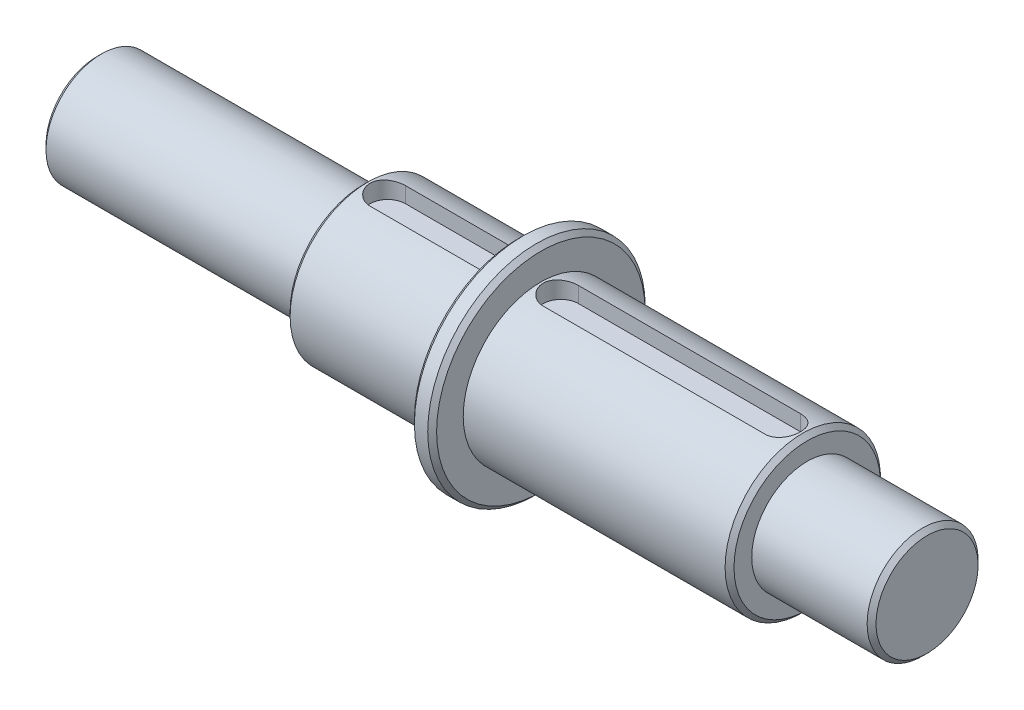
ISO-10303-21;
HEADER;
FILE_DESCRIPTION(('STEP AP214'),'2;1');
FILE_NAME('part.step','',(''),(''),'','','');
FILE_SCHEMA(('AUTOMOTIVE_DESIGN { 1 0 10303 214 1 1 1 1 }'));
ENDSEC;
DATA;
#1=APPLICATION_CONTEXT('core data for automotive mechanical design processes');
#2=APPLICATION_PROTOCOL_DEFINITION('international standard','automotive_design',2000,#1);
#3=PRODUCT_CONTEXT('',#1,'mechanical');
#4=PRODUCT('Part','Part','',(#3));
#5=PRODUCT_RELATED_PRODUCT_CATEGORY('part','',(#4));
#6=PRODUCT_DEFINITION_FORMATION('','',#4);
#7=PRODUCT_DEFINITION_CONTEXT('part definition',#1,'design');
#8=PRODUCT_DEFINITION('design','',#6,#7);
#9=PRODUCT_DEFINITION_SHAPE('','',#8);
#10=(LENGTH_UNIT() NAMED_UNIT(*) SI_UNIT(.MILLI.,.METRE.));
#11=(NAMED_UNIT(*) PLANE_ANGLE_UNIT() SI_UNIT($,.RADIAN.));
#12=(NAMED_UNIT(*) SI_UNIT($,.STERADIAN.) SOLID_ANGLE_UNIT());
#13=UNCERTAINTY_MEASURE_WITH_UNIT(LENGTH_MEASURE(1.E-05),#10,'distance_accuracy_value','');
#14=(GEOMETRIC_REPRESENTATION_CONTEXT(3) GLOBAL_UNCERTAINTY_ASSIGNED_CONTEXT((#13)) GLOBAL_UNIT_ASSIGNED_CONTEXT((#10,
#11,#12)) REPRESENTATION_CONTEXT('',''));
#15=CARTESIAN_POINT('',(0.,0.,0.));
#16=DIRECTION('',(0.,0.,1.));
#17=DIRECTION('',(1.,0.,0.));
#18=AXIS2_PLACEMENT_3D('',#15,#16,#17);
#19=CARTESIAN_POINT('',(-94.1955366631243,0.,0.));
#20=DIRECTION('',(1.,0.,0.));
#21=DIRECTION('',(0.,0.,-1.));
#22=AXIS2_PLACEMENT_3D('',#19,#20,#21);
#23=PLANE('',#22);
#24=CARTESIAN_POINT('',(-94.1955366631243,0.,0.));
#25=DIRECTION('',(-1.,0.,0.));
#26=DIRECTION('',(0.,0.,1.));
#27=AXIS2_PLACEMENT_3D('',#24,#25,#26);
#28=CIRCLE('',#27,11.5);
#29=CARTESIAN_POINT('',(-94.1955366631243,0.,11.5));
#30=VERTEX_POINT('',#29);
#31=EDGE_CURVE('E196',#30,#30,#28,.T.);
#32=ORIENTED_EDGE('',*,*,#31,.T.);
#33=EDGE_LOOP('',(#32));
#34=FACE_BOUND('',#33,.T.);
#35=ADVANCED_FACE('F33',(#34),#23,.F.);
#36=CARTESIAN_POINT('',(-93.1955366631243,0.,0.));
#37=DIRECTION('',(1.,0.,0.));
#38=DIRECTION('',(0.,0.,-1.));
#39=AXIS2_PLACEMENT_3D('',#36,#37,#38);
#40=CONICAL_SURFACE('',#39,12.5,0.785398163397448);
#41=ORIENTED_EDGE('',*,*,#31,.F.);
#42=EDGE_LOOP('',(#41));
#43=FACE_BOUND('',#42,.T.);
#44=CARTESIAN_POINT('',(-93.1955366631243,0.,0.));
#45=DIRECTION('',(-1.,0.,0.));
#46=DIRECTION('',(0.,0.,1.));
#47=AXIS2_PLACEMENT_3D('',#44,#45,#46);
#48=CIRCLE('',#47,12.5);
#49=CARTESIAN_POINT('',(-93.1955366631243,0.,12.5));
#50=VERTEX_POINT('',#49);
#51=EDGE_CURVE('E193',#50,#50,#48,.T.);
#52=ORIENTED_EDGE('',*,*,#51,.T.);
#53=EDGE_LOOP('',(#52));
#54=FACE_BOUND('',#53,.T.);
#55=ADVANCED_FACE('F285',(#43,#54),#40,.T.);
#56=CARTESIAN_POINT('',(-126.190223166844,0.,0.));
#57=DIRECTION('',(-1.,0.,0.));
#58=DIRECTION('',(0.,0.,1.));
#59=AXIS2_PLACEMENT_3D('',#56,#57,#58);
#60=CYLINDRICAL_SURFACE('',#59,12.5);
#61=ORIENTED_EDGE('',*,*,#51,.F.);
#62=EDGE_LOOP('',(#61));
#63=FACE_BOUND('',#62,.T.);
#64=CARTESIAN_POINT('',(-34.1955366631243,0.,0.));
#65=DIRECTION('',(-1.,0.,0.));
#66=DIRECTION('',(0.,0.,1.));
#67=AXIS2_PLACEMENT_3D('',#64,#65,#66);
#68=CIRCLE('',#67,12.5);
#69=CARTESIAN_POINT('',(-34.1955366631243,0.,12.5));
#70=VERTEX_POINT('',#69);
#71=EDGE_CURVE('E190',#70,#70,#68,.T.);
#72=ORIENTED_EDGE('',*,*,#71,.T.);
#73=EDGE_LOOP('',(#72));
#74=FACE_BOUND('',#73,.T.);
#75=ADVANCED_FACE('F290',(#63,#74),#60,.T.);
#76=CARTESIAN_POINT('',(-34.1955366631243,12.5,0.));
#77=DIRECTION('',(1.,0.,0.));
#78=DIRECTION('',(0.,0.,-1.));
#79=AXIS2_PLACEMENT_3D('',#76,#77,#78);
#80=PLANE('',#79);
#81=ORIENTED_EDGE('',*,*,#71,.F.);
#82=EDGE_LOOP('',(#81));
#83=FACE_BOUND('',#82,.T.);
#84=CARTESIAN_POINT('',(-34.1955366631243,0.,0.));
#85=DIRECTION('',(-1.,0.,0.));
#86=DIRECTION('',(0.,0.,1.));
#87=AXIS2_PLACEMENT_3D('',#84,#85,#86);
#88=CIRCLE('',#87,16.5);
#89=CARTESIAN_POINT('',(-34.1955366631243,0.,16.5));
#90=VERTEX_POINT('',#89);
#91=EDGE_CURVE('E187',#90,#90,#88,.T.);
#92=ORIENTED_EDGE('',*,*,#91,.T.);
#93=EDGE_LOOP('',(#92));
#94=FACE_BOUND('',#93,.T.);
#95=ADVANCED_FACE('F298',(#83,#94),#80,.F.);
#96=CARTESIAN_POINT('',(-33.1955366631243,0.,0.));
#97=DIRECTION('',(1.,0.,0.));
#98=DIRECTION('',(0.,0.,-1.));
#99=AXIS2_PLACEMENT_3D('',#96,#97,#98);
#100=CONICAL_SURFACE('',#99,17.5,0.785398163397448);
#101=ORIENTED_EDGE('',*,*,#91,.F.);
#102=EDGE_LOOP('',(#101));
#103=FACE_BOUND('',#102,.T.);
#104=CARTESIAN_POINT('',(-33.1955366631243,0.,0.));
#105=DIRECTION('',(-1.,0.,0.));
#106=DIRECTION('',(0.,0.,1.));
#107=AXIS2_PLACEMENT_3D('',#104,#105,#106);
#108=CIRCLE('',#107,17.5);
#109=CARTESIAN_POINT('',(-33.1955366631243,0.,17.5));
#110=VERTEX_POINT('',#109);
#111=EDGE_CURVE('E184',#110,#110,#108,.T.);
#112=ORIENTED_EDGE('',*,*,#111,.T.);
#113=EDGE_LOOP('',(#112));
#114=FACE_BOUND('',#113,.T.);
#115=ADVANCED_FACE('F304',(#103,#114),#100,.T.);
#116=CARTESIAN_POINT('',(-126.190223166844,0.,0.));
#117=DIRECTION('',(-1.,0.,0.));
#118=DIRECTION('',(0.,0.,1.));
#119=AXIS2_PLACEMENT_3D('',#116,#117,#118);
#120=CYLINDRICAL_SURFACE('',#119,17.5);
#121=DIRECTION('',(-1.,0.,0.));
#122=VECTOR('',#121,1.);
#123=CARTESIAN_POINT('',(-126.190223166844,17.0367250374008,-4.));
#124=LINE('',#123,#122);
#125=CARTESIAN_POINT('',(-28.6955366631243,17.0367250374008,-4.));
#126=VERTEX_POINT('',#125);
#127=CARTESIAN_POINT('',(-3.69553666312433,17.0367250374008,-4.));
#128=VERTEX_POINT('',#127);
#129=EDGE_CURVE('E450',#126,#128,#124,.F.);
#130=ORIENTED_EDGE('',*,*,#129,.T.);
#131=CARTESIAN_POINT('',(-3.69553666312433,17.0367250374008,-4.));
#132=CARTESIAN_POINT('',(-3.58460481410456,17.0367138660067,-4.00001248231752));
#133=CARTESIAN_POINT('',(-3.47368014016502,17.0378082617858,-3.99538546502867));
#134=CARTESIAN_POINT('',(-3.25265409588611,17.0421253952987,-3.97694932157873));
#135=CARTESIAN_POINT('',(-3.14255260631262,17.0453478185126,-3.96314155232038));
#136=CARTESIAN_POINT('',(-2.92414189825004,17.0538307536469,-3.92647318924765));
#137=CARTESIAN_POINT('',(-2.81582985492145,17.059087651771,-3.90362864568808));
#138=CARTESIAN_POINT('',(-2.60159577955464,17.0714746819689,-3.8490944107021));
#139=CARTESIAN_POINT('',(-2.49567376973885,17.0786048314525,-3.81740463706964));
#140=CARTESIAN_POINT('',(-2.18260166118932,17.1025105269156,-3.70940007909276));
#141=CARTESIAN_POINT('',(-1.97994737732587,17.1218095761762,-3.6201165136919));
#142=CARTESIAN_POINT('',(-1.59255547776641,17.1649441397841,-3.40971418070428));
#143=CARTESIAN_POINT('',(-1.40782133912761,17.1887805318677,-3.28858925176468));
#144=CARTESIAN_POINT('',(-1.05803054214704,17.2387926899631,-3.01555269417646));
#145=CARTESIAN_POINT('',(-0.893347197486583,17.2650004661165,-2.8631677865296));
#146=CARTESIAN_POINT('',(-0.59163714694968,17.3165247611238,-2.53295238865313));
#147=CARTESIAN_POINT('',(-0.454614791855364,17.3418411392541,-2.35511790297881));
#148=CARTESIAN_POINT('',(-0.210616343085567,17.3890809668325,-1.97651609742511));
#149=CARTESIAN_POINT('',(-0.104004740459063,17.410961949179,-1.77550809318057));
#150=CARTESIAN_POINT('',(0.0737762546514129,17.4484992744045,-1.35785483515843));
#151=CARTESIAN_POINT('',(0.144951827978446,17.4641567027157,-1.14121231594595));
#152=CARTESIAN_POINT('',(0.248658322795789,17.4872566687127,-0.702348968435727));
#153=CARTESIAN_POINT('',(0.28182724872572,17.4948346770719,-0.480286158684643));
#154=CARTESIAN_POINT('',(0.310575995234099,17.5013922359856,-0.0336222528298666));
#155=CARTESIAN_POINT('',(0.306159643764582,17.5003726621791,0.190978582456414));
#156=CARTESIAN_POINT('',(0.260332286863607,17.489952340558,0.631926010215037));
#157=CARTESIAN_POINT('',(0.219610131994176,17.4807076590668,0.848348430712727));
#158=CARTESIAN_POINT('',(0.103427371770545,17.4550549045918,1.27120201757733));
#159=CARTESIAN_POINT('',(0.027965390159794,17.4386465478123,1.4776327877559));
#160=CARTESIAN_POINT('',(-0.156146943612312,17.4002626903077,1.87652973429282));
#161=CARTESIAN_POINT('',(-0.265054023060563,17.3782443578209,2.06887311134545));
#162=CARTESIAN_POINT('',(-0.512779675138129,17.3310474587669,2.43280009121924));
#163=CARTESIAN_POINT('',(-0.65160185262817,17.3058685114888,2.60438118822771));
#164=CARTESIAN_POINT('',(-0.958894797972993,17.2544419046369,2.92598580900956));
#165=CARTESIAN_POINT('',(-1.12796440070044,17.2281829516239,3.07543489417491));
#166=CARTESIAN_POINT('',(-1.48920196613512,17.1780692090276,3.34405202485233));
#167=CARTESIAN_POINT('',(-1.68137622076386,17.1542150775981,3.46321179425783));
#168=CARTESIAN_POINT('',(-1.98315850428012,17.1222689727167,3.61671597326183));
#169=CARTESIAN_POINT('',(-2.08628698762569,17.1122387789592,3.66376574815988));
#170=CARTESIAN_POINT('',(-2.29627486329387,17.0937715302981,3.7489839926838));
#171=CARTESIAN_POINT('',(-2.4031327615524,17.0853338458964,3.78715597297674));
#172=CARTESIAN_POINT('',(-2.61970405454273,17.0703178704533,3.85427424858371));
#173=CARTESIAN_POINT('',(-2.72941436172098,17.0637376534167,3.88323010403838));
#174=CARTESIAN_POINT('',(-2.95095569027301,17.0526294698307,3.9317231468982));
#175=CARTESIAN_POINT('',(-3.06278568563791,17.0481005355421,3.95126477595514));
#176=CARTESIAN_POINT('',(-3.26153373797797,17.0420340571271,3.97733749089981));
#177=CARTESIAN_POINT('',(-3.34818510043883,17.0400453891908,3.98583914323426));
#178=CARTESIAN_POINT('',(-3.52173396015255,17.0373899876292,3.99716769798061));
#179=CARTESIAN_POINT('',(-3.60863081316125,17.0367210727584,4.00000396405785));
#180=CARTESIAN_POINT('',(-3.69553666312433,17.0367250374008,4.));
#181=B_SPLINE_CURVE_WITH_KNOTS('',3,(#131,#132,#133,#134,#135,#136,#137,#138,#139,#140,#141,
#142,#143,#144,#145,#146,#147,#148,#149,#150,#151,#152,#153,#154,#155,#156,#157,#158,#159,#160,
#161,#162,#163,#164,#165,#166,#167,#168,#169,#170,#171,#172,#173,#174,#175,#176,#177,#178,#179,
#180),.UNSPECIFIED.,.F.,.F.,(4,2,2,2,2,2,2,2,2,2,2,2,2,2,2,2,2,2,2,2,2,2,2,2,4),(0.,
0.332681247866697,0.665313336820848,0.997357270100383,1.32940428944207,1.99290262989595,
2.65652945292504,3.33106339250548,4.00570334664101,4.68811868485082,5.37041495269124,
6.0410817607265,6.71168026410031,7.36981967360707,8.02798515827641,8.69133469760162,
9.35476421731793,10.0331782060872,10.7117773626502,11.0528239514451,11.3937354453644,
11.7342921410368,12.0746880036043,12.3357711604052,12.5964224446493),.UNSPECIFIED.);
#182=CARTESIAN_POINT('',(-3.69553666312433,17.0367250374008,4.));
#183=VERTEX_POINT('',#182);
#184=EDGE_CURVE('E199',#128,#183,#181,.T.);
#185=ORIENTED_EDGE('',*,*,#184,.T.);
#186=DIRECTION('',(-1.,0.,0.));
#187=VECTOR('',#186,1.);
#188=CARTESIAN_POINT('',(-126.190223166844,17.0367250374008,4.));
#189=LINE('',#188,#187);
#190=CARTESIAN_POINT('',(-28.6955366631243,17.0367250374008,4.));
#191=VERTEX_POINT('',#190);
#192=EDGE_CURVE('E452',#183,#191,#189,.T.);
#193=ORIENTED_EDGE('',*,*,#192,.T.);
#194=CARTESIAN_POINT('',(-28.6955366631243,17.0367250374008,4.));
#195=CARTESIAN_POINT('',(-28.8064685121441,17.0367138660067,4.00001248231751));
#196=CARTESIAN_POINT('',(-28.9173931860836,17.0378082617858,3.99538546502867));
#197=CARTESIAN_POINT('',(-29.1384192303626,17.0421253952987,3.97694932157873));
#198=CARTESIAN_POINT('',(-29.248520719936,17.0453478185126,3.96314155232038));
#199=CARTESIAN_POINT('',(-29.4669314279986,17.0538307536469,3.92647318924765));
#200=CARTESIAN_POINT('',(-29.5752434713272,17.059087651771,3.90362864568808));
#201=CARTESIAN_POINT('',(-29.789477546694,17.0714746819689,3.8490944107021));
#202=CARTESIAN_POINT('',(-29.8953995565098,17.0786048314525,3.81740463706964));
#203=CARTESIAN_POINT('',(-30.2084716650593,17.1025105269156,3.70940007909276));
#204=CARTESIAN_POINT('',(-30.4111259489228,17.1218095761762,3.6201165136919));
#205=CARTESIAN_POINT('',(-30.7985178484823,17.1649441397841,3.40971418070428));
#206=CARTESIAN_POINT('',(-30.9832519871211,17.1887805318677,3.28858925176468));
#207=CARTESIAN_POINT('',(-31.3330427841016,17.2387926899631,3.01555269417646));
#208=CARTESIAN_POINT('',(-31.4977261287621,17.2650004661165,2.86316778652959));
#209=CARTESIAN_POINT('',(-31.799436179299,17.3165247611238,2.53295238865313));
#210=CARTESIAN_POINT('',(-31.9364585343933,17.3418411392541,2.35511790297881));
#211=CARTESIAN_POINT('',(-32.1804569831631,17.3890809668325,1.97651609742511));
#212=CARTESIAN_POINT('',(-32.2870685857896,17.410961949179,1.77550809318057));
#213=CARTESIAN_POINT('',(-32.4648495809001,17.4484992744045,1.35785483515843));
#214=CARTESIAN_POINT('',(-32.5360251542271,17.4641567027157,1.14121231594595));
#215=CARTESIAN_POINT('',(-32.6397316490444,17.4872566687127,0.702348968435725));
#216=CARTESIAN_POINT('',(-32.6729005749744,17.4948346770719,0.480286158684641));
#217=CARTESIAN_POINT('',(-32.7016493214828,17.5013922359856,0.0336222528298658));
#218=CARTESIAN_POINT('',(-32.6972329700132,17.5003726621791,-0.190978582456415));
#219=CARTESIAN_POINT('',(-32.6514056131123,17.489952340558,-0.631926010215037));
#220=CARTESIAN_POINT('',(-32.6106834582428,17.4807076590668,-0.848348430712726));
#221=CARTESIAN_POINT('',(-32.4945006980192,17.4550549045918,-1.27120201757732));
#222=CARTESIAN_POINT('',(-32.4190387164085,17.4386465478123,-1.4776327877559));
#223=CARTESIAN_POINT('',(-32.2349263826363,17.4002626903077,-1.87652973429282));
#224=CARTESIAN_POINT('',(-32.1260193031881,17.3782443578209,-2.06887311134545));
#225=CARTESIAN_POINT('',(-31.8782936511105,17.3310474587669,-2.43280009121924));
#226=CARTESIAN_POINT('',(-31.7394714736205,17.3058685114888,-2.60438118822771));
#227=CARTESIAN_POINT('',(-31.4321785282757,17.2544419046369,-2.92598580900956));
#228=CARTESIAN_POINT('',(-31.2631089255482,17.2281829516239,-3.0754348941749));
#229=CARTESIAN_POINT('',(-30.9018713601135,17.1780692090276,-3.34405202485233));
#230=CARTESIAN_POINT('',(-30.7096971054848,17.1542150775981,-3.46321179425783));
#231=CARTESIAN_POINT('',(-30.4079148219685,17.1222689727167,-3.61671597326183));
#232=CARTESIAN_POINT('',(-30.304786338623,17.1122387789592,-3.66376574815988));
#233=CARTESIAN_POINT('',(-30.0947984629548,17.0937715302981,-3.7489839926838));
#234=CARTESIAN_POINT('',(-29.9879405646963,17.0853338458964,-3.78715597297674));
#235=CARTESIAN_POINT('',(-29.7713692717059,17.0703178704533,-3.8542742485837));
#236=CARTESIAN_POINT('',(-29.6616589645277,17.0637376534167,-3.88323010403838));
#237=CARTESIAN_POINT('',(-29.4401176359756,17.0526294698307,-3.9317231468982));
#238=CARTESIAN_POINT('',(-29.3282876406107,17.0481005355421,-3.95126477595514));
#239=CARTESIAN_POINT('',(-29.1295395882707,17.0420340571271,-3.97733749089981));
#240=CARTESIAN_POINT('',(-29.0428882258098,17.0400453891908,-3.98583914323426));
#241=CARTESIAN_POINT('',(-28.8693393660961,17.0373899876292,-3.99716769798061));
#242=CARTESIAN_POINT('',(-28.7824425130874,17.0367210727584,-4.00000396405785));
#243=CARTESIAN_POINT('',(-28.6955366631243,17.0367250374008,-4.));
#244=B_SPLINE_CURVE_WITH_KNOTS('',3,(#194,#195,#196,#197,#198,#199,#200,#201,#202,#203,#204,
#205,#206,#207,#208,#209,#210,#211,#212,#213,#214,#215,#216,#217,#218,#219,#220,#221,#222,#223,
#224,#225,#226,#227,#228,#229,#230,#231,#232,#233,#234,#235,#236,#237,#238,#239,#240,#241,#242,
#243),.UNSPECIFIED.,.F.,.F.,(4,2,2,2,2,2,2,2,2,2,2,2,2,2,2,2,2,2,2,2,2,2,2,2,4),(0.,
0.332681247866694,0.665313336820848,0.997357270100378,1.32940428944207,1.99290262989595,
2.65652945292504,3.33106339250549,4.005703346641,4.68811868485082,5.37041495269124,
6.0410817607265,6.71168026410032,7.36981967360707,8.02798515827642,8.69133469760162,
9.35476421731793,10.0331782060872,10.7117773626502,11.0528239514451,11.3937354453644,
11.7342921410368,12.0746880036043,12.3357711604052,12.5964224446493),.UNSPECIFIED.);
#245=EDGE_CURVE('E55',#191,#126,#244,.T.);
#246=ORIENTED_EDGE('',*,*,#245,.T.);
#247=EDGE_LOOP('',(#130,#185,#193,#246));
#248=FACE_BOUND('',#247,.T.);
#249=ORIENTED_EDGE('',*,*,#111,.F.);
#250=EDGE_LOOP('',(#249));
#251=FACE_BOUND('',#250,.T.);
#252=CARTESIAN_POINT('',(0.804463336875672,0.,0.));
#253=DIRECTION('',(-1.,0.,0.));
#254=DIRECTION('',(0.,0.,1.));
#255=AXIS2_PLACEMENT_3D('',#252,#253,#254);
#256=CIRCLE('',#255,17.5);
#257=CARTESIAN_POINT('',(0.804463336875672,0.,17.5));
#258=VERTEX_POINT('',#257);
#259=EDGE_CURVE('E181',#258,#258,#256,.T.);
#260=ORIENTED_EDGE('',*,*,#259,.T.);
#261=EDGE_LOOP('',(#260));
#262=FACE_BOUND('',#261,.T.);
#263=ADVANCED_FACE('F214',(#248,#251,#262),#120,.T.);
#264=CARTESIAN_POINT('',(0.804463336875672,17.5,0.));
#265=DIRECTION('',(1.,0.,0.));
#266=DIRECTION('',(0.,0.,-1.));
#267=AXIS2_PLACEMENT_3D('',#264,#265,#266);
#268=PLANE('',#267);
#269=ORIENTED_EDGE('',*,*,#259,.F.);
#270=EDGE_LOOP('',(#269));
#271=FACE_BOUND('',#270,.T.);
#272=CARTESIAN_POINT('',(0.804463336875672,0.,0.));
#273=DIRECTION('',(-1.,0.,0.));
#274=DIRECTION('',(0.,0.,1.));
#275=AXIS2_PLACEMENT_3D('',#272,#273,#274);
#276=CIRCLE('',#275,23.5);
#277=CARTESIAN_POINT('',(0.804463336875672,0.,23.5));
#278=VERTEX_POINT('',#277);
#279=EDGE_CURVE('E178',#278,#278,#276,.T.);
#280=ORIENTED_EDGE('',*,*,#279,.T.);
#281=EDGE_LOOP('',(#280));
#282=FACE_BOUND('',#281,.T.);
#283=ADVANCED_FACE('F314',(#271,#282),#268,.F.);
#284=CARTESIAN_POINT('',(1.80446333687567,0.,0.));
#285=DIRECTION('',(1.,0.,0.));
#286=DIRECTION('',(0.,0.,-1.));
#287=AXIS2_PLACEMENT_3D('',#284,#285,#286);
#288=CONICAL_SURFACE('',#287,24.5,0.785398163397448);
#289=ORIENTED_EDGE('',*,*,#279,.F.);
#290=EDGE_LOOP('',(#289));
#291=FACE_BOUND('',#290,.T.);
#292=CARTESIAN_POINT('',(1.80446333687567,0.,0.));
#293=DIRECTION('',(-1.,0.,0.));
#294=DIRECTION('',(0.,0.,1.));
#295=AXIS2_PLACEMENT_3D('',#292,#293,#294);
#296=CIRCLE('',#295,24.5);
#297=CARTESIAN_POINT('',(1.80446333687567,0.,24.5));
#298=VERTEX_POINT('',#297);
#299=EDGE_CURVE('E175',#298,#298,#296,.T.);
#300=ORIENTED_EDGE('',*,*,#299,.T.);
#301=EDGE_LOOP('',(#300));
#302=FACE_BOUND('',#301,.T.);
#303=ADVANCED_FACE('F320',(#291,#302),#288,.T.);
#304=CARTESIAN_POINT('',(-126.190223166844,0.,0.));
#305=DIRECTION('',(-1.,0.,0.));
#306=DIRECTION('',(0.,0.,1.));
#307=AXIS2_PLACEMENT_3D('',#304,#305,#306);
#308=CYLINDRICAL_SURFACE('',#307,24.5);
#309=ORIENTED_EDGE('',*,*,#299,.F.);
#310=EDGE_LOOP('',(#309));
#311=FACE_BOUND('',#310,.T.);
#312=CARTESIAN_POINT('',(4.80446333687568,0.,0.));
#313=DIRECTION('',(-1.,0.,0.));
#314=DIRECTION('',(0.,0.,1.));
#315=AXIS2_PLACEMENT_3D('',#312,#313,#314);
#316=CIRCLE('',#315,24.5);
#317=CARTESIAN_POINT('',(4.80446333687568,0.,24.5));
#318=VERTEX_POINT('',#317);
#319=EDGE_CURVE('E172',#318,#318,#316,.T.);
#320=ORIENTED_EDGE('',*,*,#319,.T.);
#321=EDGE_LOOP('',(#320));
#322=FACE_BOUND('',#321,.T.);
#323=ADVANCED_FACE('F325',(#311,#322),#308,.T.);
#324=CARTESIAN_POINT('',(5.80446333687568,0.,0.));
#325=DIRECTION('',(-1.,0.,0.));
#326=DIRECTION('',(0.,0.,1.));
#327=AXIS2_PLACEMENT_3D('',#324,#325,#326);
#328=CONICAL_SURFACE('',#327,23.5,0.785398163397448);
#329=ORIENTED_EDGE('',*,*,#319,.F.);
#330=EDGE_LOOP('',(#329));
#331=FACE_BOUND('',#330,.T.);
#332=CARTESIAN_POINT('',(5.80446333687568,0.,0.));
#333=DIRECTION('',(-1.,0.,0.));
#334=DIRECTION('',(0.,0.,1.));
#335=AXIS2_PLACEMENT_3D('',#332,#333,#334);
#336=CIRCLE('',#335,23.5);
#337=CARTESIAN_POINT('',(5.80446333687568,0.,23.5));
#338=VERTEX_POINT('',#337);
#339=EDGE_CURVE('E169',#338,#338,#336,.T.);
#340=ORIENTED_EDGE('',*,*,#339,.T.);
#341=EDGE_LOOP('',(#340));
#342=FACE_BOUND('',#341,.T.);
#343=ADVANCED_FACE('F331',(#331,#342),#328,.T.);
#344=CARTESIAN_POINT('',(5.80446333687568,23.5,0.));
#345=DIRECTION('',(-1.,0.,0.));
#346=DIRECTION('',(0.,0.,1.));
#347=AXIS2_PLACEMENT_3D('',#344,#345,#346);
#348=PLANE('',#347);
#349=ORIENTED_EDGE('',*,*,#339,.F.);
#350=EDGE_LOOP('',(#349));
#351=FACE_BOUND('',#350,.T.);
#352=CARTESIAN_POINT('',(5.80446333687568,0.,0.));
#353=DIRECTION('',(-1.,0.,0.));
#354=DIRECTION('',(0.,0.,1.));
#355=AXIS2_PLACEMENT_3D('',#352,#353,#354);
#356=CIRCLE('',#355,17.5);
#357=CARTESIAN_POINT('',(5.80446333687568,0.,17.5));
#358=VERTEX_POINT('',#357);
#359=EDGE_CURVE('E166',#358,#358,#356,.T.);
#360=ORIENTED_EDGE('',*,*,#359,.T.);
#361=EDGE_LOOP('',(#360));
#362=FACE_BOUND('',#361,.T.);
#363=ADVANCED_FACE('F258',(#351,#362),#348,.F.);
#364=CARTESIAN_POINT('',(-126.190223166844,0.,0.));
#365=DIRECTION('',(-1.,0.,0.));
#366=DIRECTION('',(0.,0.,1.));
#367=AXIS2_PLACEMENT_3D('',#364,#365,#366);
#368=CYLINDRICAL_SURFACE('',#367,17.5);
#369=DIRECTION('',(-1.,0.,0.));
#370=VECTOR('',#369,1.);
#371=CARTESIAN_POINT('',(-126.190223166844,17.0367250374008,-4.));
#372=LINE('',#371,#370);
#373=CARTESIAN_POINT('',(10.3044633368757,17.0367250374008,-4.));
#374=VERTEX_POINT('',#373);
#375=CARTESIAN_POINT('',(60.3044633368757,17.0367250374008,-4.));
#376=VERTEX_POINT('',#375);
#377=EDGE_CURVE('E11',#374,#376,#372,.F.);
#378=ORIENTED_EDGE('',*,*,#377,.T.);
#379=CARTESIAN_POINT('',(60.3044633368757,17.0367250374008,-4.));
#380=CARTESIAN_POINT('',(60.4153951858954,17.0367138660067,-4.00001248231751));
#381=CARTESIAN_POINT('',(60.526319859835,17.0378082617858,-3.99538546502867));
#382=CARTESIAN_POINT('',(60.7473459041139,17.0421253952987,-3.97694932157872));
#383=CARTESIAN_POINT('',(60.8574473936874,17.0453478185126,-3.96314155232038));
#384=CARTESIAN_POINT('',(61.07585810175,17.0538307536469,-3.92647318924765));
#385=CARTESIAN_POINT('',(61.1841701450785,17.059087651771,-3.90362864568808));
#386=CARTESIAN_POINT('',(61.3984042204454,17.0714746819689,-3.8490944107021));
#387=CARTESIAN_POINT('',(61.5043262302611,17.0786048314525,-3.81740463706963));
#388=CARTESIAN_POINT('',(61.8173983388107,17.1025105269156,-3.70940007909276));
#389=CARTESIAN_POINT('',(62.0200526226741,17.1218095761762,-3.6201165136919));
#390=CARTESIAN_POINT('',(62.4074445222336,17.1649441397841,-3.40971418070429));
#391=CARTESIAN_POINT('',(62.5921786608724,17.1887805318677,-3.28858925176469));
#392=CARTESIAN_POINT('',(62.9419694578529,17.2387926899631,-3.01555269417647));
#393=CARTESIAN_POINT('',(63.1066528025134,17.2650004661165,-2.8631677865296));
#394=CARTESIAN_POINT('',(63.4083628530503,17.3165247611238,-2.53295238865314));
#395=CARTESIAN_POINT('',(63.5453852081446,17.3418411392541,-2.35511790297881));
#396=CARTESIAN_POINT('',(63.7893836569144,17.3890809668325,-1.97651609742511));
#397=CARTESIAN_POINT('',(63.8959952595409,17.410961949179,-1.77550809318057));
#398=CARTESIAN_POINT('',(64.0737762546514,17.4484992744045,-1.35785483515843));
#399=CARTESIAN_POINT('',(64.1449518279785,17.4641567027157,-1.14121231594596));
#400=CARTESIAN_POINT('',(64.2486583227958,17.4872566687127,-0.702348968435736));
#401=CARTESIAN_POINT('',(64.2818272487257,17.4948346770719,-0.48028615868465));
#402=CARTESIAN_POINT('',(64.3105759952341,17.5013922359856,-0.0336222528298706));
#403=CARTESIAN_POINT('',(64.3061596437646,17.5003726621791,0.190978582456411));
#404=CARTESIAN_POINT('',(64.2603322868636,17.489952340558,0.631926010215034));
#405=CARTESIAN_POINT('',(64.2196101319942,17.4807076590668,0.848348430712724));
#406=CARTESIAN_POINT('',(64.1034273717706,17.4550549045918,1.27120201757732));
#407=CARTESIAN_POINT('',(64.0279653901598,17.4386465478123,1.47763278775589));
#408=CARTESIAN_POINT('',(63.8438530563877,17.4002626903077,1.87652973429281));
#409=CARTESIAN_POINT('',(63.7349459769394,17.3782443578209,2.06887311134544));
#410=CARTESIAN_POINT('',(63.4872203248619,17.3310474587669,2.43280009121923));
#411=CARTESIAN_POINT('',(63.3483981473718,17.3058685114888,2.6043811882277));
#412=CARTESIAN_POINT('',(63.041105202027,17.2544419046369,2.92598580900956));
#413=CARTESIAN_POINT('',(62.8720355992996,17.2281829516239,3.0754348941749));
#414=CARTESIAN_POINT('',(62.5107980338649,17.1780692090276,3.34405202485233));
#415=CARTESIAN_POINT('',(62.3186237792361,17.1542150775981,3.46321179425783));
#416=CARTESIAN_POINT('',(62.0168414957199,17.1222689727167,3.61671597326183));
#417=CARTESIAN_POINT('',(61.9137130123743,17.1122387789592,3.66376574815988));
#418=CARTESIAN_POINT('',(61.7037251367061,17.0937715302981,3.7489839926838));
#419=CARTESIAN_POINT('',(61.5968672384476,17.0853338458964,3.78715597297673));
#420=CARTESIAN_POINT('',(61.3802959454573,17.0703178704533,3.8542742485837));
#421=CARTESIAN_POINT('',(61.270585638279,17.0637376534167,3.88323010403837));
#422=CARTESIAN_POINT('',(61.049044309727,17.0526294698307,3.93172314689819));
#423=CARTESIAN_POINT('',(60.9372143143621,17.0481005355421,3.95126477595513));
#424=CARTESIAN_POINT('',(60.7384662620221,17.0420340571271,3.97733749089981));
#425=CARTESIAN_POINT('',(60.6518148995612,17.0400453891908,3.98583914323426));
#426=CARTESIAN_POINT('',(60.4782660398475,17.0373899876292,3.99716769798061));
#427=CARTESIAN_POINT('',(60.3913691868388,17.0367210727584,4.00000396405785));
#428=CARTESIAN_POINT('',(60.3044633368757,17.0367250374008,4.));
#429=B_SPLINE_CURVE_WITH_KNOTS('',3,(#379,#380,#381,#382,#383,#384,#385,#386,#387,#388,#389,
#390,#391,#392,#393,#394,#395,#396,#397,#398,#399,#400,#401,#402,#403,#404,#405,#406,#407,#408,
#409,#410,#411,#412,#413,#414,#415,#416,#417,#418,#419,#420,#421,#422,#423,#424,#425,#426,#427,
#428),.UNSPECIFIED.,.F.,.F.,(4,2,2,2,2,2,2,2,2,2,2,2,2,2,2,2,2,2,2,2,2,2,2,2,4),(0.,
0.332681247866701,0.665313336820848,0.997357270100385,1.32940428944207,1.99290262989594,
2.65652945292503,3.33106339250548,4.005703346641,4.68811868485081,5.37041495269123,
6.04108176072649,6.71168026410031,7.36981967360707,8.02798515827641,8.69133469760161,
9.35476421731792,10.0331782060872,10.7117773626502,11.0528239514451,11.3937354453644,
11.7342921410368,12.0746880036043,12.3357711604052,12.5964224446493),.UNSPECIFIED.);
#430=CARTESIAN_POINT('',(60.3044633368757,17.0367250374008,4.));
#431=VERTEX_POINT('',#430);
#432=EDGE_CURVE('E263',#376,#431,#429,.T.);
#433=ORIENTED_EDGE('',*,*,#432,.T.);
#434=DIRECTION('',(-1.,0.,0.));
#435=VECTOR('',#434,1.);
#436=CARTESIAN_POINT('',(-126.190223166844,17.0367250374008,4.));
#437=LINE('',#436,#435);
#438=CARTESIAN_POINT('',(10.3044633368757,17.0367250374008,4.));
#439=VERTEX_POINT('',#438);
#440=EDGE_CURVE('E40',#431,#439,#437,.T.);
#441=ORIENTED_EDGE('',*,*,#440,.T.);
#442=CARTESIAN_POINT('',(10.3044633368757,17.0367250374008,4.));
#443=CARTESIAN_POINT('',(10.1935314878559,17.0367138660067,4.00001248231751));
#444=CARTESIAN_POINT('',(10.0826068139164,17.0378082617858,3.99538546502867));
#445=CARTESIAN_POINT('',(9.86158076963745,17.0421253952987,3.97694932157872));
#446=CARTESIAN_POINT('',(9.75147928006396,17.0453478185126,3.96314155232038));
#447=CARTESIAN_POINT('',(9.53306857200138,17.0538307536469,3.92647318924765));
#448=CARTESIAN_POINT('',(9.4247565286728,17.059087651771,3.90362864568808));
#449=CARTESIAN_POINT('',(9.21052245330598,17.0714746819689,3.8490944107021));
#450=CARTESIAN_POINT('',(9.1046004434902,17.0786048314525,3.81740463706963));
#451=CARTESIAN_POINT('',(8.79152833494067,17.1025105269156,3.70940007909276));
#452=CARTESIAN_POINT('',(8.58887405107721,17.1218095761762,3.6201165136919));
#453=CARTESIAN_POINT('',(8.20148215151775,17.1649441397841,3.40971418070428));
#454=CARTESIAN_POINT('',(8.01674801287895,17.1887805318677,3.28858925176468));
#455=CARTESIAN_POINT('',(7.66695721589839,17.2387926899631,3.01555269417646));
#456=CARTESIAN_POINT('',(7.50227387123793,17.2650004661165,2.86316778652959));
#457=CARTESIAN_POINT('',(7.20056382070102,17.3165247611238,2.53295238865313));
#458=CARTESIAN_POINT('',(7.06354146560671,17.3418411392541,2.35511790297881));
#459=CARTESIAN_POINT('',(6.81954301683691,17.3890809668325,1.97651609742511));
#460=CARTESIAN_POINT('',(6.71293141421041,17.410961949179,1.77550809318057));
#461=CARTESIAN_POINT('',(6.53515041909993,17.4484992744045,1.35785483515843));
#462=CARTESIAN_POINT('',(6.4639748457729,17.4641567027157,1.14121231594595));
#463=CARTESIAN_POINT('',(6.36026835095556,17.4872566687127,0.702348968435728));
#464=CARTESIAN_POINT('',(6.32709942502562,17.4948346770719,0.480286158684644));
#465=CARTESIAN_POINT('',(6.29835067851725,17.5013922359856,0.0336222528298681));
#466=CARTESIAN_POINT('',(6.30276702998676,17.5003726621791,-0.190978582456412));
#467=CARTESIAN_POINT('',(6.34859438688774,17.489952340558,-0.631926010215035));
#468=CARTESIAN_POINT('',(6.38931654175717,17.4807076590668,-0.848348430712725));
#469=CARTESIAN_POINT('',(6.5054993019808,17.4550549045918,-1.27120201757732));
#470=CARTESIAN_POINT('',(6.58096128359155,17.4386465478123,-1.47763278775589));
#471=CARTESIAN_POINT('',(6.76507361736366,17.4002626903077,-1.87652973429281));
#472=CARTESIAN_POINT('',(6.87398069681191,17.3782443578209,-2.06887311134545));
#473=CARTESIAN_POINT('',(7.12170634888947,17.3310474587669,-2.43280009121923));
#474=CARTESIAN_POINT('',(7.26052852637951,17.3058685114888,-2.60438118822771));
#475=CARTESIAN_POINT('',(7.56782147172434,17.2544419046369,-2.92598580900956));
#476=CARTESIAN_POINT('',(7.73689107445179,17.2281829516239,-3.0754348941749));
#477=CARTESIAN_POINT('',(8.09812863988647,17.1780692090276,-3.34405202485233));
#478=CARTESIAN_POINT('',(8.2903028945152,17.1542150775981,-3.46321179425783));
#479=CARTESIAN_POINT('',(8.59208517803147,17.1222689727167,-3.61671597326183));
#480=CARTESIAN_POINT('',(8.69521366137704,17.1122387789592,-3.66376574815988));
#481=CARTESIAN_POINT('',(8.90520153704522,17.0937715302981,-3.7489839926838));
#482=CARTESIAN_POINT('',(9.01205943530374,17.0853338458964,-3.78715597297673));
#483=CARTESIAN_POINT('',(9.22863072829407,17.0703178704533,-3.8542742485837));
#484=CARTESIAN_POINT('',(9.33834103547232,17.0637376534167,-3.88323010403838));
#485=CARTESIAN_POINT('',(9.55988236402435,17.0526294698307,-3.93172314689819));
#486=CARTESIAN_POINT('',(9.67171235938925,17.0481005355421,-3.95126477595514));
#487=CARTESIAN_POINT('',(9.87046041172931,17.0420340571271,-3.97733749089981));
#488=CARTESIAN_POINT('',(9.95711177419017,17.0400453891908,-3.98583914323426));
#489=CARTESIAN_POINT('',(10.1306606339039,17.0373899876292,-3.99716769798061));
#490=CARTESIAN_POINT('',(10.2175574869126,17.0367210727584,-4.00000396405785));
#491=CARTESIAN_POINT('',(10.3044633368757,17.0367250374008,-4.));
#492=B_SPLINE_CURVE_WITH_KNOTS('',3,(#442,#443,#444,#445,#446,#447,#448,#449,#450,#451,#452,
#453,#454,#455,#456,#457,#458,#459,#460,#461,#462,#463,#464,#465,#466,#467,#468,#469,#470,#471,
#472,#473,#474,#475,#476,#477,#478,#479,#480,#481,#482,#483,#484,#485,#486,#487,#488,#489,#490,
#491),.UNSPECIFIED.,.F.,.F.,(4,2,2,2,2,2,2,2,2,2,2,2,2,2,2,2,2,2,2,2,2,2,2,2,4),(0.,
0.332681247866699,0.66531333682085,0.997357270100385,1.32940428944207,1.99290262989595,
2.65652945292504,3.33106339250548,4.00570334664101,4.68811868485081,5.37041495269124,
6.0410817607265,6.71168026410031,7.36981967360707,8.02798515827641,8.69133469760162,
9.35476421731793,10.0331782060872,10.7117773626502,11.0528239514451,11.3937354453644,
11.7342921410368,12.0746880036043,12.3357711604052,12.5964224446493),.UNSPECIFIED.);
#493=EDGE_CURVE('E47',#439,#374,#492,.T.);
#494=ORIENTED_EDGE('',*,*,#493,.T.);
#495=EDGE_LOOP('',(#378,#433,#441,#494));
#496=FACE_BOUND('',#495,.T.);
#497=ORIENTED_EDGE('',*,*,#359,.F.);
#498=EDGE_LOOP('',(#497));
#499=FACE_BOUND('',#498,.T.);
#500=CARTESIAN_POINT('',(64.8044633368757,0.,0.));
#501=DIRECTION('',(-1.,0.,0.));
#502=DIRECTION('',(0.,0.,1.));
#503=AXIS2_PLACEMENT_3D('',#500,#501,#502);
#504=CIRCLE('',#503,17.5);
#505=CARTESIAN_POINT('',(64.8044633368757,0.,17.5));
#506=VERTEX_POINT('',#505);
#507=EDGE_CURVE('E163',#506,#506,#504,.T.);
#508=ORIENTED_EDGE('',*,*,#507,.T.);
#509=EDGE_LOOP('',(#508));
#510=FACE_BOUND('',#509,.T.);
#511=ADVANCED_FACE('F253',(#496,#499,#510),#368,.T.);
#512=CARTESIAN_POINT('',(65.8044633368757,0.,0.));
#513=DIRECTION('',(-1.,0.,0.));
#514=DIRECTION('',(0.,0.,1.));
#515=AXIS2_PLACEMENT_3D('',#512,#513,#514);
#516=CONICAL_SURFACE('',#515,16.5,0.785398163397448);
#517=ORIENTED_EDGE('',*,*,#507,.F.);
#518=EDGE_LOOP('',(#517));
#519=FACE_BOUND('',#518,.T.);
#520=CARTESIAN_POINT('',(65.8044633368757,0.,0.));
#521=DIRECTION('',(-1.,0.,0.));
#522=DIRECTION('',(0.,0.,1.));
#523=AXIS2_PLACEMENT_3D('',#520,#521,#522);
#524=CIRCLE('',#523,16.5);
#525=CARTESIAN_POINT('',(65.8044633368757,0.,16.5));
#526=VERTEX_POINT('',#525);
#527=EDGE_CURVE('E160',#526,#526,#524,.T.);
#528=ORIENTED_EDGE('',*,*,#527,.T.);
#529=EDGE_LOOP('',(#528));
#530=FACE_BOUND('',#529,.T.);
#531=ADVANCED_FACE('F249',(#519,#530),#516,.T.);
#532=CARTESIAN_POINT('',(65.8044633368757,16.5,0.));
#533=DIRECTION('',(-1.,0.,0.));
#534=DIRECTION('',(0.,0.,1.));
#535=AXIS2_PLACEMENT_3D('',#532,#533,#534);
#536=PLANE('',#535);
#537=ORIENTED_EDGE('',*,*,#527,.F.);
#538=EDGE_LOOP('',(#537));
#539=FACE_BOUND('',#538,.T.);
#540=CARTESIAN_POINT('',(65.8044633368757,0.,0.));
#541=DIRECTION('',(-1.,0.,0.));
#542=DIRECTION('',(0.,0.,1.));
#543=AXIS2_PLACEMENT_3D('',#540,#541,#542);
#544=CIRCLE('',#543,12.5);
#545=CARTESIAN_POINT('',(65.8044633368757,0.,12.5));
#546=VERTEX_POINT('',#545);
#547=EDGE_CURVE('E157',#546,#546,#544,.T.);
#548=ORIENTED_EDGE('',*,*,#547,.T.);
#549=EDGE_LOOP('',(#548));
#550=FACE_BOUND('',#549,.T.);
#551=ADVANCED_FACE('F245',(#539,#550),#536,.F.);
#552=CARTESIAN_POINT('',(-126.190223166844,0.,0.));
#553=DIRECTION('',(-1.,0.,0.));
#554=DIRECTION('',(0.,0.,1.));
#555=AXIS2_PLACEMENT_3D('',#552,#553,#554);
#556=CYLINDRICAL_SURFACE('',#555,12.5);
#557=ORIENTED_EDGE('',*,*,#547,.F.);
#558=EDGE_LOOP('',(#557));
#559=FACE_BOUND('',#558,.T.);
#560=CARTESIAN_POINT('',(91.8044633368757,0.,0.));
#561=DIRECTION('',(-1.,0.,0.));
#562=DIRECTION('',(0.,0.,1.));
#563=AXIS2_PLACEMENT_3D('',#560,#561,#562);
#564=CIRCLE('',#563,12.5);
#565=CARTESIAN_POINT('',(91.8044633368757,0.,12.5));
#566=VERTEX_POINT('',#565);
#567=EDGE_CURVE('E154',#566,#566,#564,.T.);
#568=ORIENTED_EDGE('',*,*,#567,.T.);
#569=EDGE_LOOP('',(#568));
#570=FACE_BOUND('',#569,.T.);
#571=ADVANCED_FACE('F241',(#559,#570),#556,.T.);
#572=CARTESIAN_POINT('',(92.8044633368757,0.,0.));
#573=DIRECTION('',(-1.,0.,0.));
#574=DIRECTION('',(0.,0.,1.));
#575=AXIS2_PLACEMENT_3D('',#572,#573,#574);
#576=CONICAL_SURFACE('',#575,11.5,0.785398163397448);
#577=ORIENTED_EDGE('',*,*,#567,.F.);
#578=EDGE_LOOP('',(#577));
#579=FACE_BOUND('',#578,.T.);
#580=CARTESIAN_POINT('',(92.8044633368757,0.,0.));
#581=DIRECTION('',(-1.,0.,0.));
#582=DIRECTION('',(0.,0.,1.));
#583=AXIS2_PLACEMENT_3D('',#580,#581,#582);
#584=CIRCLE('',#583,11.5);
#585=CARTESIAN_POINT('',(92.8044633368757,0.,11.5));
#586=VERTEX_POINT('',#585);
#587=EDGE_CURVE('E144',#586,#586,#584,.T.);
#588=ORIENTED_EDGE('',*,*,#587,.T.);
#589=EDGE_LOOP('',(#588));
#590=FACE_BOUND('',#589,.T.);
#591=ADVANCED_FACE('F237',(#579,#590),#576,.T.);
#592=CARTESIAN_POINT('',(92.8044633368757,11.5,0.));
#593=DIRECTION('',(-1.,0.,0.));
#594=DIRECTION('',(0.,0.,1.));
#595=AXIS2_PLACEMENT_3D('',#592,#593,#594);
#596=PLANE('',#595);
#597=ORIENTED_EDGE('',*,*,#587,.F.);
#598=EDGE_LOOP('',(#597));
#599=FACE_BOUND('',#598,.T.);
#600=ADVANCED_FACE('F234',(#599),#596,.F.);
#601=CARTESIAN_POINT('',(-28.6955366631243,13.5,0.));
#602=DIRECTION('',(0.,1.,0.));
#603=DIRECTION('',(0.,0.,1.));
#604=AXIS2_PLACEMENT_3D('',#601,#602,#603);
#605=CYLINDRICAL_SURFACE('',#604,4.);
#606=DIRECTION('',(0.,1.,0.));
#607=VECTOR('',#606,1.);
#608=CARTESIAN_POINT('',(-28.6955366631243,13.5,4.));
#609=LINE('',#608,#607);
#610=CARTESIAN_POINT('',(-28.6955366631243,13.5,4.));
#611=VERTEX_POINT('',#610);
#612=EDGE_CURVE('E141',#611,#191,#609,.T.);
#613=ORIENTED_EDGE('',*,*,#612,.F.);
#614=CARTESIAN_POINT('',(-28.6955366631243,13.5,0.));
#615=DIRECTION('',(0.,1.,0.));
#616=DIRECTION('',(0.,0.,1.));
#617=AXIS2_PLACEMENT_3D('',#614,#615,#616);
#618=CIRCLE('',#617,4.);
#619=CARTESIAN_POINT('',(-28.6955366631243,13.5,-4.));
#620=VERTEX_POINT('',#619);
#621=EDGE_CURVE('E125',#620,#611,#618,.T.);
#622=ORIENTED_EDGE('',*,*,#621,.F.);
#623=DIRECTION('',(0.,1.,0.));
#624=VECTOR('',#623,1.);
#625=CARTESIAN_POINT('',(-28.6955366631243,13.5,-4.));
#626=LINE('',#625,#624);
#627=EDGE_CURVE('E142',#620,#126,#626,.T.);
#628=ORIENTED_EDGE('',*,*,#627,.T.);
#629=ORIENTED_EDGE('',*,*,#245,.F.);
#630=EDGE_LOOP('',(#613,#622,#628,#629));
#631=FACE_BOUND('',#630,.T.);
#632=ADVANCED_FACE('F230',(#631),#605,.F.);
#633=CARTESIAN_POINT('',(-28.6955366631243,13.5,-4.));
#634=DIRECTION('',(0.,0.,-1.));
#635=DIRECTION('',(-1.,0.,0.));
#636=AXIS2_PLACEMENT_3D('',#633,#634,#635);
#637=PLANE('',#636);
#638=ORIENTED_EDGE('',*,*,#627,.F.);
#639=DIRECTION('',(-1.,0.,0.));
#640=VECTOR('',#639,1.);
#641=CARTESIAN_POINT('',(-28.6955366631243,13.5,-4.));
#642=LINE('',#641,#640);
#643=CARTESIAN_POINT('',(-3.69553666312433,13.5,-4.));
#644=VERTEX_POINT('',#643);
#645=EDGE_CURVE('E138',#644,#620,#642,.T.);
#646=ORIENTED_EDGE('',*,*,#645,.F.);
#647=DIRECTION('',(0.,1.,0.));
#648=VECTOR('',#647,1.);
#649=CARTESIAN_POINT('',(-3.69553666312433,13.5,-4.));
#650=LINE('',#649,#648);
#651=EDGE_CURVE('E145',#644,#128,#650,.T.);
#652=ORIENTED_EDGE('',*,*,#651,.T.);
#653=ORIENTED_EDGE('',*,*,#129,.F.);
#654=EDGE_LOOP('',(#638,#646,#652,#653));
#655=FACE_BOUND('',#654,.T.);
#656=ADVANCED_FACE('F224',(#655),#637,.F.);
#657=CARTESIAN_POINT('',(-3.69553666312433,13.5,0.));
#658=DIRECTION('',(0.,1.,0.));
#659=DIRECTION('',(0.,0.,1.));
#660=AXIS2_PLACEMENT_3D('',#657,#658,#659);
#661=CYLINDRICAL_SURFACE('',#660,4.);
#662=ORIENTED_EDGE('',*,*,#651,.F.);
#663=CARTESIAN_POINT('',(-3.69553666312433,13.5,0.));
#664=DIRECTION('',(0.,1.,0.));
#665=DIRECTION('',(0.,0.,1.));
#666=AXIS2_PLACEMENT_3D('',#663,#664,#665);
#667=CIRCLE('',#666,4.);
#668=CARTESIAN_POINT('',(-3.69553666312433,13.5,4.));
#669=VERTEX_POINT('',#668);
#670=EDGE_CURVE('E135',#669,#644,#667,.T.);
#671=ORIENTED_EDGE('',*,*,#670,.F.);
#672=DIRECTION('',(0.,1.,0.));
#673=VECTOR('',#672,1.);
#674=CARTESIAN_POINT('',(-3.69553666312433,13.5,4.));
#675=LINE('',#674,#673);
#676=EDGE_CURVE('E148',#669,#183,#675,.T.);
#677=ORIENTED_EDGE('',*,*,#676,.T.);
#678=ORIENTED_EDGE('',*,*,#184,.F.);
#679=EDGE_LOOP('',(#662,#671,#677,#678));
#680=FACE_BOUND('',#679,.T.);
#681=ADVANCED_FACE('F218',(#680),#661,.F.);
#682=CARTESIAN_POINT('',(-28.6955366631243,13.5,4.));
#683=DIRECTION('',(0.,0.,1.));
#684=DIRECTION('',(1.,0.,0.));
#685=AXIS2_PLACEMENT_3D('',#682,#683,#684);
#686=PLANE('',#685);
#687=ORIENTED_EDGE('',*,*,#676,.F.);
#688=DIRECTION('',(1.,0.,0.));
#689=VECTOR('',#688,1.);
#690=CARTESIAN_POINT('',(-28.6955366631243,13.5,4.));
#691=LINE('',#690,#689);
#692=EDGE_CURVE('E132',#611,#669,#691,.T.);
#693=ORIENTED_EDGE('',*,*,#692,.F.);
#694=ORIENTED_EDGE('',*,*,#612,.T.);
#695=ORIENTED_EDGE('',*,*,#192,.F.);
#696=EDGE_LOOP('',(#687,#693,#694,#695));
#697=FACE_BOUND('',#696,.T.);
#698=ADVANCED_FACE('F223',(#697),#686,.F.);
#699=CARTESIAN_POINT('',(-28.6955366631243,13.5,0.));
#700=DIRECTION('',(0.,1.,0.));
#701=DIRECTION('',(0.,0.,1.));
#702=AXIS2_PLACEMENT_3D('',#699,#700,#701);
#703=PLANE('',#702);
#704=ORIENTED_EDGE('',*,*,#621,.T.);
#705=ORIENTED_EDGE('',*,*,#692,.T.);
#706=ORIENTED_EDGE('',*,*,#670,.T.);
#707=ORIENTED_EDGE('',*,*,#645,.T.);
#708=EDGE_LOOP('',(#704,#705,#706,#707));
#709=FACE_BOUND('',#708,.T.);
#710=ADVANCED_FACE('F228',(#709),#703,.T.);
#711=CARTESIAN_POINT('',(10.3044633368757,13.5,0.));
#712=DIRECTION('',(0.,1.,0.));
#713=DIRECTION('',(0.,0.,1.));
#714=AXIS2_PLACEMENT_3D('',#711,#712,#713);
#715=CYLINDRICAL_SURFACE('',#714,4.);
#716=DIRECTION('',(0.,1.,0.));
#717=VECTOR('',#716,1.);
#718=CARTESIAN_POINT('',(10.3044633368757,13.5,4.));
#719=LINE('',#718,#717);
#720=CARTESIAN_POINT('',(10.3044633368757,13.5,4.));
#721=VERTEX_POINT('',#720);
#722=EDGE_CURVE('E97',#721,#439,#719,.T.);
#723=ORIENTED_EDGE('',*,*,#722,.F.);
#724=CARTESIAN_POINT('',(10.3044633368757,13.5,0.));
#725=DIRECTION('',(0.,1.,0.));
#726=DIRECTION('',(0.,0.,1.));
#727=AXIS2_PLACEMENT_3D('',#724,#725,#726);
#728=CIRCLE('',#727,4.);
#729=CARTESIAN_POINT('',(10.3044633368757,13.5,-4.));
#730=VERTEX_POINT('',#729);
#731=EDGE_CURVE('E101',#730,#721,#728,.T.);
#732=ORIENTED_EDGE('',*,*,#731,.F.);
#733=DIRECTION('',(0.,1.,0.));
#734=VECTOR('',#733,1.);
#735=CARTESIAN_POINT('',(10.3044633368757,13.5,-4.));
#736=LINE('',#735,#734);
#737=EDGE_CURVE('E123',#730,#374,#736,.T.);
#738=ORIENTED_EDGE('',*,*,#737,.T.);
#739=ORIENTED_EDGE('',*,*,#493,.F.);
#740=EDGE_LOOP('',(#723,#732,#738,#739));
#741=FACE_BOUND('',#740,.T.);
#742=ADVANCED_FACE('F99',(#741),#715,.F.);
#743=CARTESIAN_POINT('',(10.3044633368757,13.5,-4.));
#744=DIRECTION('',(0.,0.,-1.));
#745=DIRECTION('',(-1.,0.,0.));
#746=AXIS2_PLACEMENT_3D('',#743,#744,#745);
#747=PLANE('',#746);
#748=ORIENTED_EDGE('',*,*,#737,.F.);
#749=DIRECTION('',(-1.,0.,0.));
#750=VECTOR('',#749,1.);
#751=CARTESIAN_POINT('',(10.3044633368757,13.5,-4.));
#752=LINE('',#751,#750);
#753=CARTESIAN_POINT('',(60.3044633368757,13.5,-4.));
#754=VERTEX_POINT('',#753);
#755=EDGE_CURVE('E106',#754,#730,#752,.T.);
#756=ORIENTED_EDGE('',*,*,#755,.F.);
#757=DIRECTION('',(0.,1.,0.));
#758=VECTOR('',#757,1.);
#759=CARTESIAN_POINT('',(60.3044633368757,13.5,-4.));
#760=LINE('',#759,#758);
#761=EDGE_CURVE('E126',#754,#376,#760,.T.);
#762=ORIENTED_EDGE('',*,*,#761,.T.);
#763=ORIENTED_EDGE('',*,*,#377,.F.);
#764=EDGE_LOOP('',(#748,#756,#762,#763));
#765=FACE_BOUND('',#764,.T.);
#766=ADVANCED_FACE('F279',(#765),#747,.F.);
#767=CARTESIAN_POINT('',(60.3044633368757,13.5,0.));
#768=DIRECTION('',(0.,1.,0.));
#769=DIRECTION('',(0.,0.,1.));
#770=AXIS2_PLACEMENT_3D('',#767,#768,#769);
#771=CYLINDRICAL_SURFACE('',#770,4.);
#772=ORIENTED_EDGE('',*,*,#761,.F.);
#773=CARTESIAN_POINT('',(60.3044633368757,13.5,0.));
#774=DIRECTION('',(0.,1.,0.));
#775=DIRECTION('',(0.,0.,1.));
#776=AXIS2_PLACEMENT_3D('',#773,#774,#775);
#777=CIRCLE('',#776,4.);
#778=CARTESIAN_POINT('',(60.3044633368757,13.5,4.));
#779=VERTEX_POINT('',#778);
#780=EDGE_CURVE('E115',#779,#754,#777,.T.);
#781=ORIENTED_EDGE('',*,*,#780,.F.);
#782=DIRECTION('',(0.,1.,0.));
#783=VECTOR('',#782,1.);
#784=CARTESIAN_POINT('',(60.3044633368757,13.5,4.));
#785=LINE('',#784,#783);
#786=EDGE_CURVE('E105',#779,#431,#785,.T.);
#787=ORIENTED_EDGE('',*,*,#786,.T.);
#788=ORIENTED_EDGE('',*,*,#432,.F.);
#789=EDGE_LOOP('',(#772,#781,#787,#788));
#790=FACE_BOUND('',#789,.T.);
#791=ADVANCED_FACE('F420',(#790),#771,.F.);
#792=CARTESIAN_POINT('',(10.3044633368757,13.5,4.));
#793=DIRECTION('',(0.,0.,1.));
#794=DIRECTION('',(1.,0.,0.));
#795=AXIS2_PLACEMENT_3D('',#792,#793,#794);
#796=PLANE('',#795);
#797=ORIENTED_EDGE('',*,*,#786,.F.);
#798=DIRECTION('',(1.,0.,0.));
#799=VECTOR('',#798,1.);
#800=CARTESIAN_POINT('',(10.3044633368757,13.5,4.));
#801=LINE('',#800,#799);
#802=EDGE_CURVE('E109',#721,#779,#801,.T.);
#803=ORIENTED_EDGE('',*,*,#802,.F.);
#804=ORIENTED_EDGE('',*,*,#722,.T.);
#805=ORIENTED_EDGE('',*,*,#440,.F.);
#806=EDGE_LOOP('',(#797,#803,#804,#805));
#807=FACE_BOUND('',#806,.T.);
#808=ADVANCED_FACE('F110',(#807),#796,.F.);
#809=CARTESIAN_POINT('',(10.3044633368757,13.5,0.));
#810=DIRECTION('',(0.,1.,0.));
#811=DIRECTION('',(0.,0.,1.));
#812=AXIS2_PLACEMENT_3D('',#809,#810,#811);
#813=PLANE('',#812);
#814=ORIENTED_EDGE('',*,*,#731,.T.);
#815=ORIENTED_EDGE('',*,*,#802,.T.);
#816=ORIENTED_EDGE('',*,*,#780,.T.);
#817=ORIENTED_EDGE('',*,*,#755,.T.);
#818=EDGE_LOOP('',(#814,#815,#816,#817));
#819=FACE_BOUND('',#818,.T.);
#820=ADVANCED_FACE('F117',(#819),#813,.T.);
#821=CLOSED_SHELL('',(#35,#55,#75,#95,#115,#263,#283,#303,#323,#343,#363,#511,#531,#551,#571,
#591,#600,#632,#656,#681,#698,#710,#742,#766,#791,#808,#820));
#822=MANIFOLD_SOLID_BREP('B2',#821);
#823=ADVANCED_BREP_SHAPE_REPRESENTATION('',(#18,#822),#14);
#824=SHAPE_DEFINITION_REPRESENTATION(#9,#823);
ENDSEC;
END-ISO-10303-21;
